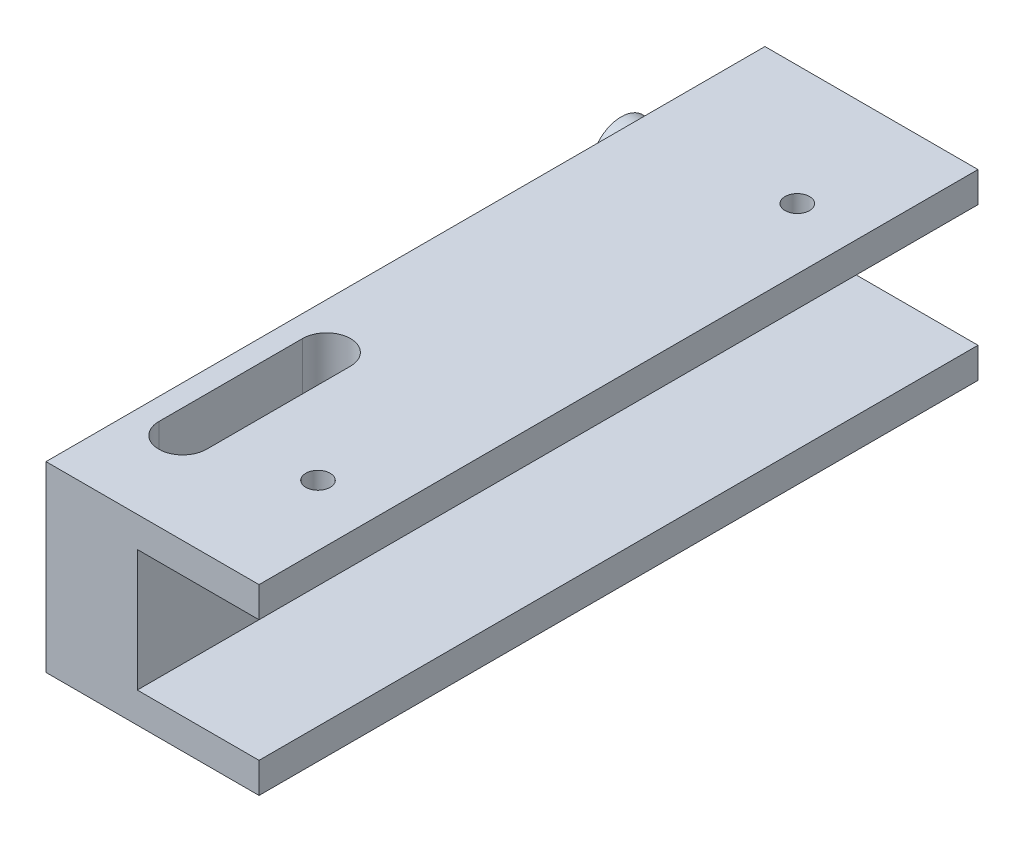
ISO-10303-21;
HEADER;
FILE_DESCRIPTION(('STEP AP214'),'2;1');
FILE_NAME('part.step','',(''),(''),'','','');
FILE_SCHEMA(('AUTOMOTIVE_DESIGN { 1 0 10303 214 1 1 1 1 }'));
ENDSEC;
DATA;
#1=APPLICATION_CONTEXT('core data for automotive mechanical design processes');
#2=APPLICATION_PROTOCOL_DEFINITION('international standard','automotive_design',2000,#1);
#3=PRODUCT_CONTEXT('',#1,'mechanical');
#4=PRODUCT('Part','Part','',(#3));
#5=PRODUCT_RELATED_PRODUCT_CATEGORY('part','',(#4));
#6=PRODUCT_DEFINITION_FORMATION('','',#4);
#7=PRODUCT_DEFINITION_CONTEXT('part definition',#1,'design');
#8=PRODUCT_DEFINITION('design','',#6,#7);
#9=PRODUCT_DEFINITION_SHAPE('','',#8);
#10=(LENGTH_UNIT() NAMED_UNIT(*) SI_UNIT(.MILLI.,.METRE.));
#11=(NAMED_UNIT(*) PLANE_ANGLE_UNIT() SI_UNIT($,.RADIAN.));
#12=(NAMED_UNIT(*) SI_UNIT($,.STERADIAN.) SOLID_ANGLE_UNIT());
#13=UNCERTAINTY_MEASURE_WITH_UNIT(LENGTH_MEASURE(1.E-05),#10,'distance_accuracy_value','');
#14=(GEOMETRIC_REPRESENTATION_CONTEXT(3) GLOBAL_UNCERTAINTY_ASSIGNED_CONTEXT((#13)) GLOBAL_UNIT_ASSIGNED_CONTEXT((#10,
#11,#12)) REPRESENTATION_CONTEXT('',''));
#15=CARTESIAN_POINT('',(0.,0.,0.));
#16=DIRECTION('',(0.,0.,1.));
#17=DIRECTION('',(1.,0.,0.));
#18=AXIS2_PLACEMENT_3D('',#15,#16,#17);
#19=CARTESIAN_POINT('',(0.,12.7,75.));
#20=DIRECTION('',(0.,1.,0.));
#21=DIRECTION('',(0.,0.,1.));
#22=AXIS2_PLACEMENT_3D('',#19,#20,#21);
#23=PLANE('',#22);
#24=CARTESIAN_POINT('',(12.7,12.7,50.));
#25=DIRECTION('',(0.,1.,0.));
#26=DIRECTION('',(0.,0.,1.));
#27=AXIS2_PLACEMENT_3D('',#24,#25,#26);
#28=CIRCLE('',#27,2.55269999999999);
#29=CARTESIAN_POINT('',(12.7,12.7,52.5527));
#30=VERTEX_POINT('',#29);
#31=EDGE_CURVE('E280',#30,#30,#28,.T.);
#32=ORIENTED_EDGE('',*,*,#31,.T.);
#33=EDGE_LOOP('',(#32));
#34=FACE_BOUND('',#33,.T.);
#35=CARTESIAN_POINT('',(12.7,12.7,-50.));
#36=DIRECTION('',(0.,1.,0.));
#37=DIRECTION('',(0.,0.,1.));
#38=AXIS2_PLACEMENT_3D('',#35,#36,#37);
#39=CIRCLE('',#38,2.55269999999999);
#40=CARTESIAN_POINT('',(12.7,12.7,-47.4473));
#41=VERTEX_POINT('',#40);
#42=EDGE_CURVE('E270',#41,#41,#39,.T.);
#43=ORIENTED_EDGE('',*,*,#42,.T.);
#44=EDGE_LOOP('',(#43));
#45=FACE_BOUND('',#44,.T.);
#46=DIRECTION('',(1.,0.,0.));
#47=VECTOR('',#46,1.);
#48=CARTESIAN_POINT('',(0.,12.7,-75.));
#49=LINE('',#48,#47);
#50=CARTESIAN_POINT('',(0.,12.7,-75.));
#51=VERTEX_POINT('',#50);
#52=CARTESIAN_POINT('',(25.4,12.7,-75.));
#53=VERTEX_POINT('',#52);
#54=EDGE_CURVE('E207',#51,#53,#49,.T.);
#55=ORIENTED_EDGE('',*,*,#54,.T.);
#56=DIRECTION('',(0.,0.,-1.));
#57=VECTOR('',#56,1.);
#58=CARTESIAN_POINT('',(25.4,12.7,75.));
#59=LINE('',#58,#57);
#60=CARTESIAN_POINT('',(25.4,12.7,75.));
#61=VERTEX_POINT('',#60);
#62=EDGE_CURVE('E167',#61,#53,#59,.T.);
#63=ORIENTED_EDGE('',*,*,#62,.F.);
#64=DIRECTION('',(1.,0.,0.));
#65=VECTOR('',#64,1.);
#66=CARTESIAN_POINT('',(0.,12.7,75.));
#67=LINE('',#66,#65);
#68=CARTESIAN_POINT('',(0.,12.7,75.));
#69=VERTEX_POINT('',#68);
#70=EDGE_CURVE('E194',#69,#61,#67,.T.);
#71=ORIENTED_EDGE('',*,*,#70,.F.);
#72=DIRECTION('',(0.,0.,-1.));
#73=VECTOR('',#72,1.);
#74=CARTESIAN_POINT('',(0.,12.7,75.));
#75=LINE('',#74,#73);
#76=EDGE_CURVE('E188',#69,#51,#75,.T.);
#77=ORIENTED_EDGE('',*,*,#76,.T.);
#78=EDGE_LOOP('',(#55,#63,#71,#77));
#79=FACE_BOUND('',#78,.T.);
#80=ADVANCED_FACE('F35',(#34,#45,#79),#23,.F.);
#81=CARTESIAN_POINT('',(25.4,12.7,75.));
#82=DIRECTION('',(-1.,0.,0.));
#83=DIRECTION('',(0.,-1.,0.));
#84=AXIS2_PLACEMENT_3D('',#81,#82,#83);
#85=PLANE('',#84);
#86=DIRECTION('',(0.,1.,0.));
#87=VECTOR('',#86,1.);
#88=CARTESIAN_POINT('',(25.4,12.7,-75.));
#89=LINE('',#88,#87);
#90=CARTESIAN_POINT('',(25.4,19.05,-75.));
#91=VERTEX_POINT('',#90);
#92=EDGE_CURVE('E205',#53,#91,#89,.T.);
#93=ORIENTED_EDGE('',*,*,#92,.T.);
#94=DIRECTION('',(0.,0.,-1.));
#95=VECTOR('',#94,1.);
#96=CARTESIAN_POINT('',(25.4,19.05,75.));
#97=LINE('',#96,#95);
#98=CARTESIAN_POINT('',(25.4,19.05,75.));
#99=VERTEX_POINT('',#98);
#100=EDGE_CURVE('E170',#99,#91,#97,.T.);
#101=ORIENTED_EDGE('',*,*,#100,.F.);
#102=DIRECTION('',(0.,1.,0.));
#103=VECTOR('',#102,1.);
#104=CARTESIAN_POINT('',(25.4,12.7,75.));
#105=LINE('',#104,#103);
#106=EDGE_CURVE('E222',#61,#99,#105,.T.);
#107=ORIENTED_EDGE('',*,*,#106,.F.);
#108=ORIENTED_EDGE('',*,*,#62,.T.);
#109=EDGE_LOOP('',(#93,#101,#107,#108));
#110=FACE_BOUND('',#109,.T.);
#111=ADVANCED_FACE('F293',(#110),#85,.F.);
#112=CARTESIAN_POINT('',(-19.05,19.05,75.));
#113=DIRECTION('',(0.,-1.,0.));
#114=DIRECTION('',(1.,0.,0.));
#115=AXIS2_PLACEMENT_3D('',#112,#113,#114);
#116=PLANE('',#115);
#117=CARTESIAN_POINT('',(12.7,19.05,50.));
#118=DIRECTION('',(0.,1.,0.));
#119=DIRECTION('',(0.,0.,1.));
#120=AXIS2_PLACEMENT_3D('',#117,#118,#119);
#121=CIRCLE('',#120,2.55269999999999);
#122=CARTESIAN_POINT('',(12.7,19.05,52.5527));
#123=VERTEX_POINT('',#122);
#124=EDGE_CURVE('E283',#123,#123,#121,.T.);
#125=ORIENTED_EDGE('',*,*,#124,.F.);
#126=EDGE_LOOP('',(#125));
#127=FACE_BOUND('',#126,.T.);
#128=CARTESIAN_POINT('',(12.7,19.05,-50.));
#129=DIRECTION('',(0.,1.,0.));
#130=DIRECTION('',(0.,0.,1.));
#131=AXIS2_PLACEMENT_3D('',#128,#129,#130);
#132=CIRCLE('',#131,2.55269999999999);
#133=CARTESIAN_POINT('',(12.7,19.05,-47.4473));
#134=VERTEX_POINT('',#133);
#135=EDGE_CURVE('E277',#134,#134,#132,.T.);
#136=ORIENTED_EDGE('',*,*,#135,.F.);
#137=EDGE_LOOP('',(#136));
#138=FACE_BOUND('',#137,.T.);
#139=DIRECTION('',(0.,0.,1.));
#140=VECTOR('',#139,1.);
#141=CARTESIAN_POINT('',(-14.525,19.05,26.));
#142=LINE('',#141,#140);
#143=CARTESIAN_POINT('',(-14.525,19.05,26.));
#144=VERTEX_POINT('',#143);
#145=CARTESIAN_POINT('',(-14.525,19.05,56.));
#146=VERTEX_POINT('',#145);
#147=EDGE_CURVE('E255',#144,#146,#142,.T.);
#148=ORIENTED_EDGE('',*,*,#147,.F.);
#149=CARTESIAN_POINT('',(-9.52500000000001,19.05,26.));
#150=DIRECTION('',(0.,1.,0.));
#151=DIRECTION('',(0.,0.,1.));
#152=AXIS2_PLACEMENT_3D('',#149,#150,#151);
#153=CIRCLE('',#152,5.);
#154=CARTESIAN_POINT('',(-4.52500000000001,19.05,26.));
#155=VERTEX_POINT('',#154);
#156=EDGE_CURVE('E258',#155,#144,#153,.T.);
#157=ORIENTED_EDGE('',*,*,#156,.F.);
#158=DIRECTION('',(0.,0.,-1.));
#159=VECTOR('',#158,1.);
#160=CARTESIAN_POINT('',(-4.52500000000001,19.05,26.));
#161=LINE('',#160,#159);
#162=CARTESIAN_POINT('',(-4.525,19.05,56.));
#163=VERTEX_POINT('',#162);
#164=EDGE_CURVE('E249',#163,#155,#161,.T.);
#165=ORIENTED_EDGE('',*,*,#164,.F.);
#166=CARTESIAN_POINT('',(-9.525,19.05,56.));
#167=DIRECTION('',(0.,1.,0.));
#168=DIRECTION('',(0.,0.,1.));
#169=AXIS2_PLACEMENT_3D('',#166,#167,#168);
#170=CIRCLE('',#169,5.);
#171=EDGE_CURVE('E252',#146,#163,#170,.T.);
#172=ORIENTED_EDGE('',*,*,#171,.F.);
#173=EDGE_LOOP('',(#148,#157,#165,#172));
#174=FACE_BOUND('',#173,.T.);
#175=DIRECTION('',(-1.,0.,0.));
#176=VECTOR('',#175,1.);
#177=CARTESIAN_POINT('',(-19.05,19.05,-75.));
#178=LINE('',#177,#176);
#179=CARTESIAN_POINT('',(-19.05,19.05,-75.));
#180=VERTEX_POINT('',#179);
#181=EDGE_CURVE('E203',#91,#180,#178,.T.);
#182=ORIENTED_EDGE('',*,*,#181,.T.);
#183=DIRECTION('',(0.,0.,-1.));
#184=VECTOR('',#183,1.);
#185=CARTESIAN_POINT('',(-19.05,19.05,75.));
#186=LINE('',#185,#184);
#187=CARTESIAN_POINT('',(-19.05,19.05,75.));
#188=VERTEX_POINT('',#187);
#189=EDGE_CURVE('E173',#188,#180,#186,.T.);
#190=ORIENTED_EDGE('',*,*,#189,.F.);
#191=DIRECTION('',(-1.,0.,0.));
#192=VECTOR('',#191,1.);
#193=CARTESIAN_POINT('',(-19.05,19.05,75.));
#194=LINE('',#193,#192);
#195=EDGE_CURVE('E220',#99,#188,#194,.T.);
#196=ORIENTED_EDGE('',*,*,#195,.F.);
#197=ORIENTED_EDGE('',*,*,#100,.T.);
#198=EDGE_LOOP('',(#182,#190,#196,#197));
#199=FACE_BOUND('',#198,.T.);
#200=ADVANCED_FACE('F289',(#127,#138,#174,#199),#116,.F.);
#201=CARTESIAN_POINT('',(-19.05,19.05,75.));
#202=DIRECTION('',(1.,0.,0.));
#203=DIRECTION('',(0.,0.,-1.));
#204=AXIS2_PLACEMENT_3D('',#201,#202,#203);
#205=PLANE('',#204);
#206=CARTESIAN_POINT('',(-19.05,0.,-60.));
#207=DIRECTION('',(1.,0.,0.));
#208=DIRECTION('',(0.,0.,-1.));
#209=AXIS2_PLACEMENT_3D('',#206,#207,#208);
#210=CIRCLE('',#209,71.5);
#211=CARTESIAN_POINT('',(-19.05,-6.23163560645759,11.2279209135598));
#212=VERTEX_POINT('',#211);
#213=CARTESIAN_POINT('',(-19.05,6.23163560645759,11.2279209135598));
#214=VERTEX_POINT('',#213);
#215=EDGE_CURVE('E263',#212,#214,#210,.F.);
#216=ORIENTED_EDGE('',*,*,#215,.T.);
#217=CARTESIAN_POINT('',(-19.05,6.5366807060744,14.7146023568809));
#218=DIRECTION('',(1.,0.,0.));
#219=DIRECTION('',(0.,0.,-1.));
#220=AXIS2_PLACEMENT_3D('',#217,#218,#219);
#221=CIRCLE('',#220,3.5);
#222=CARTESIAN_POINT('',(-19.05,6.8417258056912,18.201283800202));
#223=VERTEX_POINT('',#222);
#224=EDGE_CURVE('E260',#214,#223,#221,.T.);
#225=ORIENTED_EDGE('',*,*,#224,.T.);
#226=CARTESIAN_POINT('',(-19.05,0.,-60.));
#227=DIRECTION('',(1.,0.,0.));
#228=DIRECTION('',(0.,0.,-1.));
#229=AXIS2_PLACEMENT_3D('',#226,#227,#228);
#230=CIRCLE('',#229,78.5);
#231=CARTESIAN_POINT('',(-19.05,-6.84172580569118,18.201283800202));
#232=VERTEX_POINT('',#231);
#233=EDGE_CURVE('E267',#223,#232,#230,.T.);
#234=ORIENTED_EDGE('',*,*,#233,.T.);
#235=CARTESIAN_POINT('',(-19.05,-6.53668070607439,14.7146023568809));
#236=DIRECTION('',(1.,0.,0.));
#237=DIRECTION('',(0.,0.,-1.));
#238=AXIS2_PLACEMENT_3D('',#235,#236,#237);
#239=CIRCLE('',#238,3.50000000000001);
#240=EDGE_CURVE('E156',#232,#212,#239,.T.);
#241=ORIENTED_EDGE('',*,*,#240,.T.);
#242=EDGE_LOOP('',(#216,#225,#234,#241));
#243=FACE_BOUND('',#242,.T.);
#244=CARTESIAN_POINT('',(-19.05,0.,-60.));
#245=DIRECTION('',(1.,0.,0.));
#246=DIRECTION('',(0.,0.,-1.));
#247=AXIS2_PLACEMENT_3D('',#244,#245,#246);
#248=CIRCLE('',#247,6.35);
#249=CARTESIAN_POINT('',(-19.05,0.,-66.35));
#250=VERTEX_POINT('',#249);
#251=EDGE_CURVE('E149',#250,#250,#248,.F.);
#252=ORIENTED_EDGE('',*,*,#251,.F.);
#253=EDGE_LOOP('',(#252));
#254=FACE_BOUND('',#253,.T.);
#255=DIRECTION('',(0.,-1.,0.));
#256=VECTOR('',#255,1.);
#257=CARTESIAN_POINT('',(-19.05,19.05,-75.));
#258=LINE('',#257,#256);
#259=CARTESIAN_POINT('',(-19.05,-19.05,-75.));
#260=VERTEX_POINT('',#259);
#261=EDGE_CURVE('E201',#180,#260,#258,.T.);
#262=ORIENTED_EDGE('',*,*,#261,.T.);
#263=DIRECTION('',(0.,0.,-1.));
#264=VECTOR('',#263,1.);
#265=CARTESIAN_POINT('',(-19.05,-19.05,75.));
#266=LINE('',#265,#264);
#267=CARTESIAN_POINT('',(-19.05,-19.05,75.));
#268=VERTEX_POINT('',#267);
#269=EDGE_CURVE('E176',#268,#260,#266,.T.);
#270=ORIENTED_EDGE('',*,*,#269,.F.);
#271=DIRECTION('',(0.,-1.,0.));
#272=VECTOR('',#271,1.);
#273=CARTESIAN_POINT('',(-19.05,19.05,75.));
#274=LINE('',#273,#272);
#275=EDGE_CURVE('E218',#188,#268,#274,.T.);
#276=ORIENTED_EDGE('',*,*,#275,.F.);
#277=ORIENTED_EDGE('',*,*,#189,.T.);
#278=EDGE_LOOP('',(#262,#270,#276,#277));
#279=FACE_BOUND('',#278,.T.);
#280=ADVANCED_FACE('F292',(#243,#254,#279),#205,.F.);
#281=CARTESIAN_POINT('',(-19.05,-19.05,75.));
#282=DIRECTION('',(0.,1.,0.));
#283=DIRECTION('',(-1.,0.,0.));
#284=AXIS2_PLACEMENT_3D('',#281,#282,#283);
#285=PLANE('',#284);
#286=DIRECTION('',(0.,0.,-1.));
#287=VECTOR('',#286,1.);
#288=CARTESIAN_POINT('',(-4.52500000000001,-19.05,26.));
#289=LINE('',#288,#287);
#290=CARTESIAN_POINT('',(-4.525,-19.05,56.));
#291=VERTEX_POINT('',#290);
#292=CARTESIAN_POINT('',(-4.52500000000001,-19.05,26.));
#293=VERTEX_POINT('',#292);
#294=EDGE_CURVE('E233',#291,#293,#289,.T.);
#295=ORIENTED_EDGE('',*,*,#294,.T.);
#296=CARTESIAN_POINT('',(-9.52500000000001,-19.05,26.));
#297=DIRECTION('',(0.,1.,0.));
#298=DIRECTION('',(0.,0.,1.));
#299=AXIS2_PLACEMENT_3D('',#296,#297,#298);
#300=CIRCLE('',#299,5.);
#301=CARTESIAN_POINT('',(-14.525,-19.05,26.));
#302=VERTEX_POINT('',#301);
#303=EDGE_CURVE('E246',#293,#302,#300,.T.);
#304=ORIENTED_EDGE('',*,*,#303,.T.);
#305=DIRECTION('',(0.,0.,1.));
#306=VECTOR('',#305,1.);
#307=CARTESIAN_POINT('',(-14.525,-19.05,26.));
#308=LINE('',#307,#306);
#309=CARTESIAN_POINT('',(-14.525,-19.05,56.));
#310=VERTEX_POINT('',#309);
#311=EDGE_CURVE('E243',#302,#310,#308,.T.);
#312=ORIENTED_EDGE('',*,*,#311,.T.);
#313=CARTESIAN_POINT('',(-9.525,-19.05,56.));
#314=DIRECTION('',(0.,1.,0.));
#315=DIRECTION('',(0.,0.,1.));
#316=AXIS2_PLACEMENT_3D('',#313,#314,#315);
#317=CIRCLE('',#316,5.);
#318=EDGE_CURVE('E240',#310,#291,#317,.T.);
#319=ORIENTED_EDGE('',*,*,#318,.T.);
#320=EDGE_LOOP('',(#295,#304,#312,#319));
#321=FACE_BOUND('',#320,.T.);
#322=DIRECTION('',(1.,0.,0.));
#323=VECTOR('',#322,1.);
#324=CARTESIAN_POINT('',(-19.05,-19.05,-75.));
#325=LINE('',#324,#323);
#326=CARTESIAN_POINT('',(25.4,-19.05,-75.));
#327=VERTEX_POINT('',#326);
#328=EDGE_CURVE('E199',#260,#327,#325,.T.);
#329=ORIENTED_EDGE('',*,*,#328,.T.);
#330=DIRECTION('',(0.,0.,-1.));
#331=VECTOR('',#330,1.);
#332=CARTESIAN_POINT('',(25.4,-19.05,75.));
#333=LINE('',#332,#331);
#334=CARTESIAN_POINT('',(25.4,-19.05,75.));
#335=VERTEX_POINT('',#334);
#336=EDGE_CURVE('E179',#335,#327,#333,.T.);
#337=ORIENTED_EDGE('',*,*,#336,.F.);
#338=DIRECTION('',(1.,0.,0.));
#339=VECTOR('',#338,1.);
#340=CARTESIAN_POINT('',(-19.05,-19.05,75.));
#341=LINE('',#340,#339);
#342=EDGE_CURVE('E216',#268,#335,#341,.T.);
#343=ORIENTED_EDGE('',*,*,#342,.F.);
#344=ORIENTED_EDGE('',*,*,#269,.T.);
#345=EDGE_LOOP('',(#329,#337,#343,#344));
#346=FACE_BOUND('',#345,.T.);
#347=ADVANCED_FACE('F317',(#321,#346),#285,.F.);
#348=CARTESIAN_POINT('',(25.4,-19.05,75.));
#349=DIRECTION('',(-1.,0.,0.));
#350=DIRECTION('',(0.,-1.,0.));
#351=AXIS2_PLACEMENT_3D('',#348,#349,#350);
#352=PLANE('',#351);
#353=DIRECTION('',(0.,1.,0.));
#354=VECTOR('',#353,1.);
#355=CARTESIAN_POINT('',(25.4,-19.05,-75.));
#356=LINE('',#355,#354);
#357=CARTESIAN_POINT('',(25.4,-12.7,-75.));
#358=VERTEX_POINT('',#357);
#359=EDGE_CURVE('E197',#327,#358,#356,.T.);
#360=ORIENTED_EDGE('',*,*,#359,.T.);
#361=DIRECTION('',(0.,0.,-1.));
#362=VECTOR('',#361,1.);
#363=CARTESIAN_POINT('',(25.4,-12.7,75.));
#364=LINE('',#363,#362);
#365=CARTESIAN_POINT('',(25.4,-12.7,75.));
#366=VERTEX_POINT('',#365);
#367=EDGE_CURVE('E182',#366,#358,#364,.T.);
#368=ORIENTED_EDGE('',*,*,#367,.F.);
#369=DIRECTION('',(0.,1.,0.));
#370=VECTOR('',#369,1.);
#371=CARTESIAN_POINT('',(25.4,-19.05,75.));
#372=LINE('',#371,#370);
#373=EDGE_CURVE('E214',#335,#366,#372,.T.);
#374=ORIENTED_EDGE('',*,*,#373,.F.);
#375=ORIENTED_EDGE('',*,*,#336,.T.);
#376=EDGE_LOOP('',(#360,#368,#374,#375));
#377=FACE_BOUND('',#376,.T.);
#378=ADVANCED_FACE('F321',(#377),#352,.F.);
#379=CARTESIAN_POINT('',(0.,-12.7,75.));
#380=DIRECTION('',(0.,-1.,0.));
#381=DIRECTION('',(0.,0.,-1.));
#382=AXIS2_PLACEMENT_3D('',#379,#380,#381);
#383=PLANE('',#382);
#384=DIRECTION('',(-1.,0.,0.));
#385=VECTOR('',#384,1.);
#386=CARTESIAN_POINT('',(0.,-12.7,-75.));
#387=LINE('',#386,#385);
#388=CARTESIAN_POINT('',(0.,-12.7,-75.));
#389=VERTEX_POINT('',#388);
#390=EDGE_CURVE('E195',#358,#389,#387,.T.);
#391=ORIENTED_EDGE('',*,*,#390,.T.);
#392=DIRECTION('',(0.,0.,-1.));
#393=VECTOR('',#392,1.);
#394=CARTESIAN_POINT('',(0.,-12.7,75.));
#395=LINE('',#394,#393);
#396=CARTESIAN_POINT('',(0.,-12.7,75.));
#397=VERTEX_POINT('',#396);
#398=EDGE_CURVE('E185',#397,#389,#395,.T.);
#399=ORIENTED_EDGE('',*,*,#398,.F.);
#400=DIRECTION('',(-1.,0.,0.));
#401=VECTOR('',#400,1.);
#402=CARTESIAN_POINT('',(0.,-12.7,75.));
#403=LINE('',#402,#401);
#404=EDGE_CURVE('E212',#366,#397,#403,.T.);
#405=ORIENTED_EDGE('',*,*,#404,.F.);
#406=ORIENTED_EDGE('',*,*,#367,.T.);
#407=EDGE_LOOP('',(#391,#399,#405,#406));
#408=FACE_BOUND('',#407,.T.);
#409=ADVANCED_FACE('F335',(#408),#383,.F.);
#410=CARTESIAN_POINT('',(0.,12.7,75.));
#411=DIRECTION('',(-1.,0.,0.));
#412=DIRECTION('',(0.,0.,1.));
#413=AXIS2_PLACEMENT_3D('',#410,#411,#412);
#414=PLANE('',#413);
#415=CARTESIAN_POINT('',(0.,0.,-60.));
#416=DIRECTION('',(-1.,0.,0.));
#417=DIRECTION('',(0.,0.,1.));
#418=AXIS2_PLACEMENT_3D('',#415,#416,#417);
#419=CIRCLE('',#418,78.5);
#420=CARTESIAN_POINT('',(0.,-6.84172580569118,18.201283800202));
#421=VERTEX_POINT('',#420);
#422=CARTESIAN_POINT('',(0.,6.8417258056912,18.201283800202));
#423=VERTEX_POINT('',#422);
#424=EDGE_CURVE('E144',#421,#423,#419,.T.);
#425=ORIENTED_EDGE('',*,*,#424,.T.);
#426=CARTESIAN_POINT('',(0.,6.5366807060744,14.7146023568809));
#427=DIRECTION('',(-1.,0.,0.));
#428=DIRECTION('',(0.,0.,1.));
#429=AXIS2_PLACEMENT_3D('',#426,#427,#428);
#430=CIRCLE('',#429,3.5);
#431=CARTESIAN_POINT('',(0.,6.23163560645759,11.2279209135598));
#432=VERTEX_POINT('',#431);
#433=EDGE_CURVE('E11',#423,#432,#430,.T.);
#434=ORIENTED_EDGE('',*,*,#433,.T.);
#435=CARTESIAN_POINT('',(0.,0.,-60.));
#436=DIRECTION('',(-1.,0.,0.));
#437=DIRECTION('',(0.,0.,1.));
#438=AXIS2_PLACEMENT_3D('',#435,#436,#437);
#439=CIRCLE('',#438,71.5);
#440=CARTESIAN_POINT('',(0.,-6.23163560645759,11.2279209135598));
#441=VERTEX_POINT('',#440);
#442=EDGE_CURVE('E42',#432,#441,#439,.F.);
#443=ORIENTED_EDGE('',*,*,#442,.T.);
#444=CARTESIAN_POINT('',(0.,-6.53668070607439,14.7146023568809));
#445=DIRECTION('',(-1.,0.,0.));
#446=DIRECTION('',(0.,0.,1.));
#447=AXIS2_PLACEMENT_3D('',#444,#445,#446);
#448=CIRCLE('',#447,3.50000000000001);
#449=EDGE_CURVE('E148',#441,#421,#448,.T.);
#450=ORIENTED_EDGE('',*,*,#449,.T.);
#451=EDGE_LOOP('',(#425,#434,#443,#450));
#452=FACE_BOUND('',#451,.T.);
#453=DIRECTION('',(0.,1.,0.));
#454=VECTOR('',#453,1.);
#455=CARTESIAN_POINT('',(0.,12.7,-75.));
#456=LINE('',#455,#454);
#457=EDGE_CURVE('E192',#389,#51,#456,.T.);
#458=ORIENTED_EDGE('',*,*,#457,.T.);
#459=ORIENTED_EDGE('',*,*,#76,.F.);
#460=DIRECTION('',(0.,1.,0.));
#461=VECTOR('',#460,1.);
#462=CARTESIAN_POINT('',(0.,12.7,75.));
#463=LINE('',#462,#461);
#464=EDGE_CURVE('E191',#397,#69,#463,.T.);
#465=ORIENTED_EDGE('',*,*,#464,.F.);
#466=ORIENTED_EDGE('',*,*,#398,.T.);
#467=EDGE_LOOP('',(#458,#459,#465,#466));
#468=FACE_BOUND('',#467,.T.);
#469=ADVANCED_FACE('F161',(#452,#468),#414,.F.);
#470=CARTESIAN_POINT('',(0.,0.,75.));
#471=DIRECTION('',(0.,0.,1.));
#472=DIRECTION('',(1.,0.,0.));
#473=AXIS2_PLACEMENT_3D('',#470,#471,#472);
#474=PLANE('',#473);
#475=ORIENTED_EDGE('',*,*,#70,.T.);
#476=ORIENTED_EDGE('',*,*,#106,.T.);
#477=ORIENTED_EDGE('',*,*,#195,.T.);
#478=ORIENTED_EDGE('',*,*,#275,.T.);
#479=ORIENTED_EDGE('',*,*,#342,.T.);
#480=ORIENTED_EDGE('',*,*,#373,.T.);
#481=ORIENTED_EDGE('',*,*,#404,.T.);
#482=ORIENTED_EDGE('',*,*,#464,.T.);
#483=EDGE_LOOP('',(#475,#476,#477,#478,#479,#480,#481,#482));
#484=FACE_BOUND('',#483,.T.);
#485=ADVANCED_FACE('F325',(#484),#474,.T.);
#486=CARTESIAN_POINT('',(0.,0.,-75.));
#487=DIRECTION('',(0.,0.,1.));
#488=DIRECTION('',(1.,0.,0.));
#489=AXIS2_PLACEMENT_3D('',#486,#487,#488);
#490=PLANE('',#489);
#491=ORIENTED_EDGE('',*,*,#54,.F.);
#492=ORIENTED_EDGE('',*,*,#457,.F.);
#493=ORIENTED_EDGE('',*,*,#390,.F.);
#494=ORIENTED_EDGE('',*,*,#359,.F.);
#495=ORIENTED_EDGE('',*,*,#328,.F.);
#496=ORIENTED_EDGE('',*,*,#261,.F.);
#497=ORIENTED_EDGE('',*,*,#181,.F.);
#498=ORIENTED_EDGE('',*,*,#92,.F.);
#499=EDGE_LOOP('',(#491,#492,#493,#494,#495,#496,#497,#498));
#500=FACE_BOUND('',#499,.T.);
#501=ADVANCED_FACE('F312',(#500),#490,.F.);
#502=CARTESIAN_POINT('',(-34.05,0.,-60.));
#503=DIRECTION('',(1.,0.,0.));
#504=DIRECTION('',(0.,0.,-1.));
#505=AXIS2_PLACEMENT_3D('',#502,#503,#504);
#506=CYLINDRICAL_SURFACE('',#505,6.35);
#507=CARTESIAN_POINT('',(-34.05,0.,-60.));
#508=DIRECTION('',(-1.,0.,0.));
#509=DIRECTION('',(0.,0.,1.));
#510=AXIS2_PLACEMENT_3D('',#507,#508,#509);
#511=CIRCLE('',#510,6.35);
#512=CARTESIAN_POINT('',(-34.05,0.,-53.65));
#513=VERTEX_POINT('',#512);
#514=EDGE_CURVE('E210',#513,#513,#511,.T.);
#515=ORIENTED_EDGE('',*,*,#514,.F.);
#516=EDGE_LOOP('',(#515));
#517=FACE_BOUND('',#516,.T.);
#518=ORIENTED_EDGE('',*,*,#251,.T.);
#519=EDGE_LOOP('',(#518));
#520=FACE_BOUND('',#519,.T.);
#521=ADVANCED_FACE('F394',(#517,#520),#506,.T.);
#522=CARTESIAN_POINT('',(-34.05,0.,-60.));
#523=DIRECTION('',(-1.,0.,0.));
#524=DIRECTION('',(0.,0.,1.));
#525=AXIS2_PLACEMENT_3D('',#522,#523,#524);
#526=PLANE('',#525);
#527=ORIENTED_EDGE('',*,*,#514,.T.);
#528=EDGE_LOOP('',(#527));
#529=FACE_BOUND('',#528,.T.);
#530=ADVANCED_FACE('F390',(#529),#526,.T.);
#531=CARTESIAN_POINT('',(-9.52500000000001,-19.05,26.));
#532=DIRECTION('',(0.,1.,0.));
#533=DIRECTION('',(0.,0.,1.));
#534=AXIS2_PLACEMENT_3D('',#531,#532,#533);
#535=CYLINDRICAL_SURFACE('',#534,5.);
#536=DIRECTION('',(0.,1.,0.));
#537=VECTOR('',#536,1.);
#538=CARTESIAN_POINT('',(-14.525,-19.05,26.));
#539=LINE('',#538,#537);
#540=EDGE_CURVE('E229',#302,#144,#539,.T.);
#541=ORIENTED_EDGE('',*,*,#540,.F.);
#542=ORIENTED_EDGE('',*,*,#303,.F.);
#543=DIRECTION('',(0.,1.,0.));
#544=VECTOR('',#543,1.);
#545=CARTESIAN_POINT('',(-4.52500000000001,-19.05,26.));
#546=LINE('',#545,#544);
#547=EDGE_CURVE('E228',#293,#155,#546,.T.);
#548=ORIENTED_EDGE('',*,*,#547,.T.);
#549=ORIENTED_EDGE('',*,*,#156,.T.);
#550=EDGE_LOOP('',(#541,#542,#548,#549));
#551=FACE_BOUND('',#550,.T.);
#552=ADVANCED_FACE('F380',(#551),#535,.F.);
#553=CARTESIAN_POINT('',(-4.52500000000001,-19.05,26.));
#554=DIRECTION('',(1.,0.,0.));
#555=DIRECTION('',(0.,0.,-1.));
#556=AXIS2_PLACEMENT_3D('',#553,#554,#555);
#557=PLANE('',#556);
#558=ORIENTED_EDGE('',*,*,#547,.F.);
#559=ORIENTED_EDGE('',*,*,#294,.F.);
#560=DIRECTION('',(0.,1.,0.));
#561=VECTOR('',#560,1.);
#562=CARTESIAN_POINT('',(-4.525,-19.05,56.));
#563=LINE('',#562,#561);
#564=EDGE_CURVE('E235',#291,#163,#563,.T.);
#565=ORIENTED_EDGE('',*,*,#564,.T.);
#566=ORIENTED_EDGE('',*,*,#164,.T.);
#567=EDGE_LOOP('',(#558,#559,#565,#566));
#568=FACE_BOUND('',#567,.T.);
#569=ADVANCED_FACE('F376',(#568),#557,.F.);
#570=CARTESIAN_POINT('',(-9.525,-19.05,56.));
#571=DIRECTION('',(0.,1.,0.));
#572=DIRECTION('',(0.,0.,1.));
#573=AXIS2_PLACEMENT_3D('',#570,#571,#572);
#574=CYLINDRICAL_SURFACE('',#573,5.);
#575=ORIENTED_EDGE('',*,*,#564,.F.);
#576=ORIENTED_EDGE('',*,*,#318,.F.);
#577=DIRECTION('',(0.,1.,0.));
#578=VECTOR('',#577,1.);
#579=CARTESIAN_POINT('',(-14.525,-19.05,56.));
#580=LINE('',#579,#578);
#581=EDGE_CURVE('E232',#310,#146,#580,.T.);
#582=ORIENTED_EDGE('',*,*,#581,.T.);
#583=ORIENTED_EDGE('',*,*,#171,.T.);
#584=EDGE_LOOP('',(#575,#576,#582,#583));
#585=FACE_BOUND('',#584,.T.);
#586=ADVANCED_FACE('F379',(#585),#574,.F.);
#587=CARTESIAN_POINT('',(-14.525,-19.05,26.));
#588=DIRECTION('',(-1.,0.,0.));
#589=DIRECTION('',(0.,0.,1.));
#590=AXIS2_PLACEMENT_3D('',#587,#588,#589);
#591=PLANE('',#590);
#592=ORIENTED_EDGE('',*,*,#581,.F.);
#593=ORIENTED_EDGE('',*,*,#311,.F.);
#594=ORIENTED_EDGE('',*,*,#540,.T.);
#595=ORIENTED_EDGE('',*,*,#147,.T.);
#596=EDGE_LOOP('',(#592,#593,#594,#595));
#597=FACE_BOUND('',#596,.T.);
#598=ADVANCED_FACE('F374',(#597),#591,.F.);
#599=CARTESIAN_POINT('',(-34.05,6.5366807060744,14.7146023568809));
#600=DIRECTION('',(1.,0.,0.));
#601=DIRECTION('',(0.,0.,-1.));
#602=AXIS2_PLACEMENT_3D('',#599,#600,#601);
#603=CYLINDRICAL_SURFACE('',#602,3.5);
#604=DIRECTION('',(1.,0.,0.));
#605=VECTOR('',#604,1.);
#606=CARTESIAN_POINT('',(-34.05,6.23163560645759,11.2279209135598));
#607=LINE('',#606,#605);
#608=EDGE_CURVE('E269',#214,#432,#607,.T.);
#609=ORIENTED_EDGE('',*,*,#608,.T.);
#610=ORIENTED_EDGE('',*,*,#433,.F.);
#611=DIRECTION('',(1.,0.,0.));
#612=VECTOR('',#611,1.);
#613=CARTESIAN_POINT('',(-34.05,6.8417258056912,18.201283800202));
#614=LINE('',#613,#612);
#615=EDGE_CURVE('E54',#223,#423,#614,.T.);
#616=ORIENTED_EDGE('',*,*,#615,.F.);
#617=ORIENTED_EDGE('',*,*,#224,.F.);
#618=EDGE_LOOP('',(#609,#610,#616,#617));
#619=FACE_BOUND('',#618,.T.);
#620=ADVANCED_FACE('F368',(#619),#603,.F.);
#621=CARTESIAN_POINT('',(-34.05,0.,-60.));
#622=DIRECTION('',(1.,0.,0.));
#623=DIRECTION('',(0.,0.,-1.));
#624=AXIS2_PLACEMENT_3D('',#621,#622,#623);
#625=CYLINDRICAL_SURFACE('',#624,71.5);
#626=DIRECTION('',(1.,0.,0.));
#627=VECTOR('',#626,1.);
#628=CARTESIAN_POINT('',(-34.05,-6.23163560645759,11.2279209135598));
#629=LINE('',#628,#627);
#630=EDGE_CURVE('E158',#212,#441,#629,.T.);
#631=ORIENTED_EDGE('',*,*,#630,.T.);
#632=ORIENTED_EDGE('',*,*,#442,.F.);
#633=ORIENTED_EDGE('',*,*,#608,.F.);
#634=ORIENTED_EDGE('',*,*,#215,.F.);
#635=EDGE_LOOP('',(#631,#632,#633,#634));
#636=FACE_BOUND('',#635,.T.);
#637=ADVANCED_FACE('F365',(#636),#625,.T.);
#638=CARTESIAN_POINT('',(-34.05,-6.53668070607439,14.7146023568809));
#639=DIRECTION('',(1.,0.,0.));
#640=DIRECTION('',(0.,0.,-1.));
#641=AXIS2_PLACEMENT_3D('',#638,#639,#640);
#642=CYLINDRICAL_SURFACE('',#641,3.50000000000001);
#643=DIRECTION('',(1.,0.,0.));
#644=VECTOR('',#643,1.);
#645=CARTESIAN_POINT('',(-34.05,-6.84172580569118,18.201283800202));
#646=LINE('',#645,#644);
#647=EDGE_CURVE('E49',#232,#421,#646,.T.);
#648=ORIENTED_EDGE('',*,*,#647,.T.);
#649=ORIENTED_EDGE('',*,*,#449,.F.);
#650=ORIENTED_EDGE('',*,*,#630,.F.);
#651=ORIENTED_EDGE('',*,*,#240,.F.);
#652=EDGE_LOOP('',(#648,#649,#650,#651));
#653=FACE_BOUND('',#652,.T.);
#654=ADVANCED_FACE('F152',(#653),#642,.F.);
#655=CARTESIAN_POINT('',(-34.05,0.,-60.));
#656=DIRECTION('',(1.,0.,0.));
#657=DIRECTION('',(0.,0.,-1.));
#658=AXIS2_PLACEMENT_3D('',#655,#656,#657);
#659=CYLINDRICAL_SURFACE('',#658,78.5);
#660=ORIENTED_EDGE('',*,*,#615,.T.);
#661=ORIENTED_EDGE('',*,*,#424,.F.);
#662=ORIENTED_EDGE('',*,*,#647,.F.);
#663=ORIENTED_EDGE('',*,*,#233,.F.);
#664=EDGE_LOOP('',(#660,#661,#662,#663));
#665=FACE_BOUND('',#664,.T.);
#666=ADVANCED_FACE('F145',(#665),#659,.F.);
#667=CARTESIAN_POINT('',(12.7,19.05,-50.));
#668=DIRECTION('',(0.,1.,0.));
#669=DIRECTION('',(0.,0.,1.));
#670=AXIS2_PLACEMENT_3D('',#667,#668,#669);
#671=CYLINDRICAL_SURFACE('',#670,2.55269999999999);
#672=ORIENTED_EDGE('',*,*,#42,.F.);
#673=EDGE_LOOP('',(#672));
#674=FACE_BOUND('',#673,.T.);
#675=ORIENTED_EDGE('',*,*,#135,.T.);
#676=EDGE_LOOP('',(#675));
#677=FACE_BOUND('',#676,.T.);
#678=ADVANCED_FACE('F353',(#674,#677),#671,.F.);
#679=CARTESIAN_POINT('',(12.7,19.05,50.));
#680=DIRECTION('',(0.,1.,0.));
#681=DIRECTION('',(0.,0.,1.));
#682=AXIS2_PLACEMENT_3D('',#679,#680,#681);
#683=CYLINDRICAL_SURFACE('',#682,2.55269999999999);
#684=ORIENTED_EDGE('',*,*,#31,.F.);
#685=EDGE_LOOP('',(#684));
#686=FACE_BOUND('',#685,.T.);
#687=ORIENTED_EDGE('',*,*,#124,.T.);
#688=EDGE_LOOP('',(#687));
#689=FACE_BOUND('',#688,.T.);
#690=ADVANCED_FACE('F287',(#686,#689),#683,.F.);
#691=CLOSED_SHELL('',(#80,#111,#200,#280,#347,#378,#409,#469,#485,#501,#521,#530,#552,#569,#586,
#598,#620,#637,#654,#666,#678,#690));
#692=MANIFOLD_SOLID_BREP('B2',#691);
#693=ADVANCED_BREP_SHAPE_REPRESENTATION('',(#18,#692),#14);
#694=SHAPE_DEFINITION_REPRESENTATION(#9,#693);
ENDSEC;
END-ISO-10303-21;
